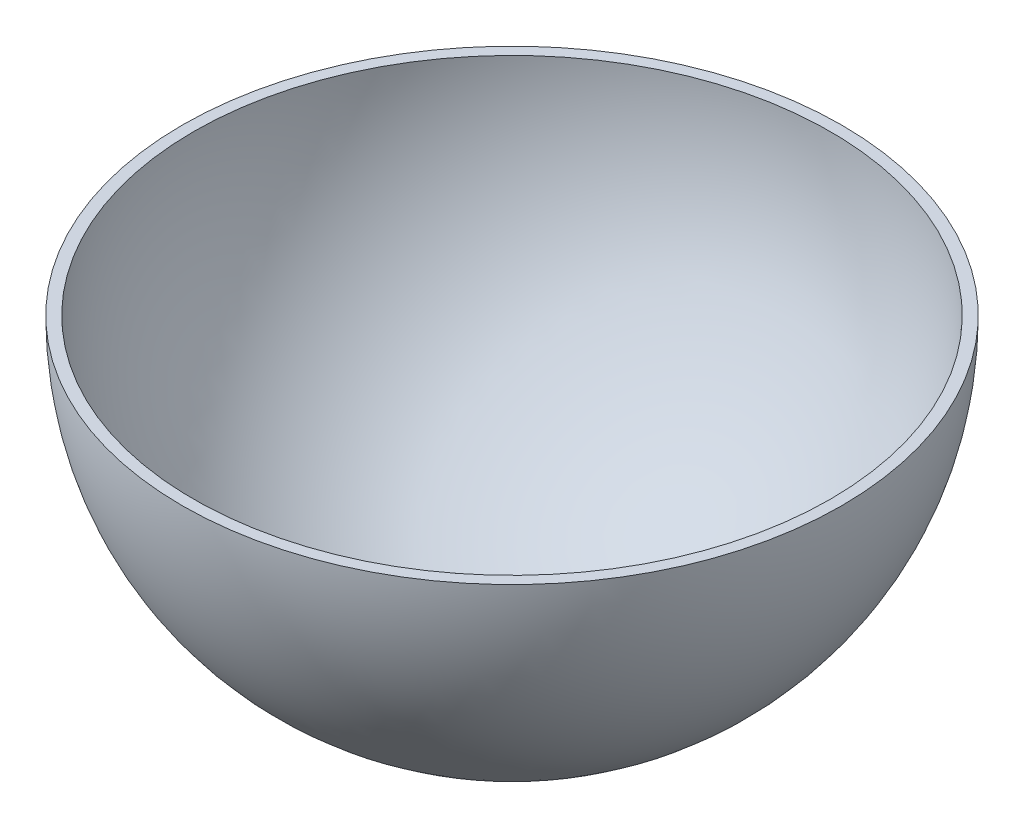
ISO-10303-21;
HEADER;
FILE_DESCRIPTION(('STEP AP214'),'2;1');
FILE_NAME('part.step','',(''),(''),'','','');
FILE_SCHEMA(('AUTOMOTIVE_DESIGN { 1 0 10303 214 1 1 1 1 }'));
ENDSEC;
DATA;
#1=APPLICATION_CONTEXT('core data for automotive mechanical design processes');
#2=APPLICATION_PROTOCOL_DEFINITION('international standard','automotive_design',2000,#1);
#3=PRODUCT_CONTEXT('',#1,'mechanical');
#4=PRODUCT('Part','Part','',(#3));
#5=PRODUCT_RELATED_PRODUCT_CATEGORY('part','',(#4));
#6=PRODUCT_DEFINITION_FORMATION('','',#4);
#7=PRODUCT_DEFINITION_CONTEXT('part definition',#1,'design');
#8=PRODUCT_DEFINITION('design','',#6,#7);
#9=PRODUCT_DEFINITION_SHAPE('','',#8);
#10=(LENGTH_UNIT() NAMED_UNIT(*) SI_UNIT(.MILLI.,.METRE.));
#11=(NAMED_UNIT(*) PLANE_ANGLE_UNIT() SI_UNIT($,.RADIAN.));
#12=(NAMED_UNIT(*) SI_UNIT($,.STERADIAN.) SOLID_ANGLE_UNIT());
#13=UNCERTAINTY_MEASURE_WITH_UNIT(LENGTH_MEASURE(1.E-05),#10,'distance_accuracy_value','');
#14=(GEOMETRIC_REPRESENTATION_CONTEXT(3) GLOBAL_UNCERTAINTY_ASSIGNED_CONTEXT((#13)) GLOBAL_UNIT_ASSIGNED_CONTEXT((#10,
#11,#12)) REPRESENTATION_CONTEXT('',''));
#15=CARTESIAN_POINT('',(0.,0.,0.));
#16=DIRECTION('',(0.,0.,1.));
#17=DIRECTION('',(1.,0.,0.));
#18=AXIS2_PLACEMENT_3D('',#15,#16,#17);
#19=CARTESIAN_POINT('',(0.,0.,0.));
#20=DIRECTION('',(0.,1.,0.));
#21=DIRECTION('',(1.,0.,0.));
#22=AXIS2_PLACEMENT_3D('',#19,#20,#21);
#23=SPHERICAL_SURFACE('',#22,35.);
#24=CARTESIAN_POINT('',(0.,0.,0.));
#25=DIRECTION('',(0.,1.,0.));
#26=DIRECTION('',(-1.,0.,0.));
#27=AXIS2_PLACEMENT_3D('',#24,#25,#26);
#28=CIRCLE('',#27,35.);
#29=CARTESIAN_POINT('',(-35.,0.,0.));
#30=VERTEX_POINT('',#29);
#31=EDGE_CURVE('E42',#30,#30,#28,.T.);
#32=ORIENTED_EDGE('',*,*,#31,.F.);
#33=EDGE_LOOP('',(#32));
#34=FACE_BOUND('',#33,.T.);
#35=ADVANCED_FACE('F36',(#34),#23,.T.);
#36=CARTESIAN_POINT('',(0.,0.,0.));
#37=DIRECTION('',(0.,1.,0.));
#38=DIRECTION('',(1.,0.,0.));
#39=AXIS2_PLACEMENT_3D('',#36,#37,#38);
#40=SPHERICAL_SURFACE('',#39,33.8);
#41=CARTESIAN_POINT('',(0.,0.,0.));
#42=DIRECTION('',(0.,1.,0.));
#43=DIRECTION('',(-1.,0.,0.));
#44=AXIS2_PLACEMENT_3D('',#41,#42,#43);
#45=CIRCLE('',#44,33.8);
#46=CARTESIAN_POINT('',(-33.8,0.,0.));
#47=VERTEX_POINT('',#46);
#48=EDGE_CURVE('E10',#47,#47,#45,.T.);
#49=ORIENTED_EDGE('',*,*,#48,.T.);
#50=EDGE_LOOP('',(#49));
#51=FACE_BOUND('',#50,.T.);
#52=ADVANCED_FACE('F51',(#51),#40,.F.);
#53=CARTESIAN_POINT('',(35.,0.,0.));
#54=DIRECTION('',(0.,-1.,0.));
#55=DIRECTION('',(1.,0.,0.));
#56=AXIS2_PLACEMENT_3D('',#53,#54,#55);
#57=PLANE('',#56);
#58=ORIENTED_EDGE('',*,*,#48,.F.);
#59=EDGE_LOOP('',(#58));
#60=FACE_BOUND('',#59,.T.);
#61=ORIENTED_EDGE('',*,*,#31,.T.);
#62=EDGE_LOOP('',(#61));
#63=FACE_BOUND('',#62,.T.);
#64=ADVANCED_FACE('F48',(#60,#63),#57,.F.);
#65=CLOSED_SHELL('',(#35,#52,#64));
#66=MANIFOLD_SOLID_BREP('B2',#65);
#67=ADVANCED_BREP_SHAPE_REPRESENTATION('',(#18,#66),#14);
#68=SHAPE_DEFINITION_REPRESENTATION(#9,#67);
ENDSEC;
END-ISO-10303-21;
